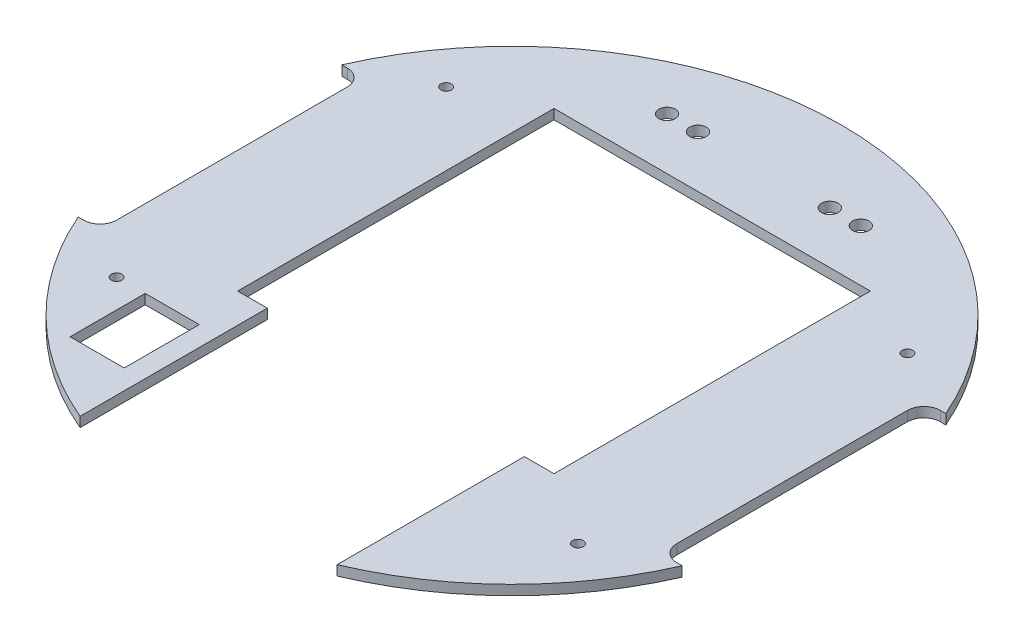
ISO-10303-21;
HEADER;
FILE_DESCRIPTION(('STEP AP214'),'2;1');
FILE_NAME('part.step','',(''),(''),'','','');
FILE_SCHEMA(('AUTOMOTIVE_DESIGN { 1 0 10303 214 1 1 1 1 }'));
ENDSEC;
DATA;
#1=APPLICATION_CONTEXT('core data for automotive mechanical design processes');
#2=APPLICATION_PROTOCOL_DEFINITION('international standard','automotive_design',2000,#1);
#3=PRODUCT_CONTEXT('',#1,'mechanical');
#4=PRODUCT('Part','Part','',(#3));
#5=PRODUCT_RELATED_PRODUCT_CATEGORY('part','',(#4));
#6=PRODUCT_DEFINITION_FORMATION('','',#4);
#7=PRODUCT_DEFINITION_CONTEXT('part definition',#1,'design');
#8=PRODUCT_DEFINITION('design','',#6,#7);
#9=PRODUCT_DEFINITION_SHAPE('','',#8);
#10=(LENGTH_UNIT() NAMED_UNIT(*) SI_UNIT(.MILLI.,.METRE.));
#11=(NAMED_UNIT(*) PLANE_ANGLE_UNIT() SI_UNIT($,.RADIAN.));
#12=(NAMED_UNIT(*) SI_UNIT($,.STERADIAN.) SOLID_ANGLE_UNIT());
#13=UNCERTAINTY_MEASURE_WITH_UNIT(LENGTH_MEASURE(1.E-05),#10,'distance_accuracy_value','');
#14=(GEOMETRIC_REPRESENTATION_CONTEXT(3) GLOBAL_UNCERTAINTY_ASSIGNED_CONTEXT((#13)) GLOBAL_UNIT_ASSIGNED_CONTEXT((#10,
#11,#12)) REPRESENTATION_CONTEXT('',''));
#15=CARTESIAN_POINT('',(0.,0.,0.));
#16=DIRECTION('',(0.,0.,1.));
#17=DIRECTION('',(1.,0.,0.));
#18=AXIS2_PLACEMENT_3D('',#15,#16,#17);
#19=CARTESIAN_POINT('',(85.,3.,0.));
#20=DIRECTION('',(1.,0.,0.));
#21=DIRECTION('',(0.,0.,-1.));
#22=AXIS2_PLACEMENT_3D('',#19,#20,#21);
#23=PLANE('',#22);
#24=DIRECTION('',(0.,0.,1.));
#25=VECTOR('',#24,1.);
#26=CARTESIAN_POINT('',(85.,0.,0.));
#27=LINE('',#26,#25);
#28=CARTESIAN_POINT('',(85.,0.,-35.));
#29=VERTEX_POINT('',#28);
#30=CARTESIAN_POINT('',(85.,0.,35.));
#31=VERTEX_POINT('',#30);
#32=EDGE_CURVE('E379',#29,#31,#27,.T.);
#33=ORIENTED_EDGE('',*,*,#32,.F.);
#34=DIRECTION('',(0.,-1.,0.));
#35=VECTOR('',#34,1.);
#36=CARTESIAN_POINT('',(85.,3.,-35.));
#37=LINE('',#36,#35);
#38=CARTESIAN_POINT('',(85.,3.,-35.));
#39=VERTEX_POINT('',#38);
#40=EDGE_CURVE('E11',#39,#29,#37,.T.);
#41=ORIENTED_EDGE('',*,*,#40,.F.);
#42=DIRECTION('',(0.,0.,1.));
#43=VECTOR('',#42,1.);
#44=CARTESIAN_POINT('',(85.,3.,0.));
#45=LINE('',#44,#43);
#46=CARTESIAN_POINT('',(85.,3.,35.));
#47=VERTEX_POINT('',#46);
#48=EDGE_CURVE('E482',#39,#47,#45,.T.);
#49=ORIENTED_EDGE('',*,*,#48,.T.);
#50=DIRECTION('',(0.,-1.,0.));
#51=VECTOR('',#50,1.);
#52=CARTESIAN_POINT('',(85.,3.,35.));
#53=LINE('',#52,#51);
#54=EDGE_CURVE('E61',#47,#31,#53,.T.);
#55=ORIENTED_EDGE('',*,*,#54,.T.);
#56=EDGE_LOOP('',(#33,#41,#49,#55));
#57=FACE_BOUND('',#56,.T.);
#58=ADVANCED_FACE('F41',(#57),#23,.T.);
#59=CARTESIAN_POINT('',(90.0000000000001,3.,-35.));
#60=DIRECTION('',(0.,-1.,0.));
#61=DIRECTION('',(0.,0.,-1.));
#62=AXIS2_PLACEMENT_3D('',#59,#60,#61);
#63=CYLINDRICAL_SURFACE('',#62,5.);
#64=CARTESIAN_POINT('',(90.0000000000001,0.,-35.));
#65=DIRECTION('',(0.,1.,0.));
#66=DIRECTION('',(0.,0.,1.));
#67=AXIS2_PLACEMENT_3D('',#64,#65,#66);
#68=CIRCLE('',#67,5.);
#69=CARTESIAN_POINT('',(90.0000000000001,0.,-40.));
#70=VERTEX_POINT('',#69);
#71=EDGE_CURVE('E375',#29,#70,#68,.F.);
#72=ORIENTED_EDGE('',*,*,#71,.T.);
#73=DIRECTION('',(0.,-1.,0.));
#74=VECTOR('',#73,1.);
#75=CARTESIAN_POINT('',(90.0000000000001,3.,-40.));
#76=LINE('',#75,#74);
#77=CARTESIAN_POINT('',(90.0000000000001,3.,-40.));
#78=VERTEX_POINT('',#77);
#79=EDGE_CURVE('E52',#78,#70,#76,.T.);
#80=ORIENTED_EDGE('',*,*,#79,.F.);
#81=CARTESIAN_POINT('',(90.0000000000001,3.,-35.));
#82=DIRECTION('',(0.,1.,0.));
#83=DIRECTION('',(0.,0.,1.));
#84=AXIS2_PLACEMENT_3D('',#81,#82,#83);
#85=CIRCLE('',#84,5.);
#86=EDGE_CURVE('E479',#39,#78,#85,.F.);
#87=ORIENTED_EDGE('',*,*,#86,.F.);
#88=ORIENTED_EDGE('',*,*,#40,.T.);
#89=EDGE_LOOP('',(#72,#80,#87,#88));
#90=FACE_BOUND('',#89,.T.);
#91=ADVANCED_FACE('F567',(#90),#63,.F.);
#92=CARTESIAN_POINT('',(0.,3.,-40.));
#93=DIRECTION('',(0.,0.,1.));
#94=DIRECTION('',(1.,0.,0.));
#95=AXIS2_PLACEMENT_3D('',#92,#93,#94);
#96=PLANE('',#95);
#97=DIRECTION('',(-1.,0.,0.));
#98=VECTOR('',#97,1.);
#99=CARTESIAN_POINT('',(0.,0.,-40.));
#100=LINE('',#99,#98);
#101=CARTESIAN_POINT('',(91.6515138991168,0.,-40.));
#102=VERTEX_POINT('',#101);
#103=EDGE_CURVE('E371',#102,#70,#100,.T.);
#104=ORIENTED_EDGE('',*,*,#103,.F.);
#105=DIRECTION('',(0.,-1.,0.));
#106=VECTOR('',#105,1.);
#107=CARTESIAN_POINT('',(91.6515138991168,3.,-40.));
#108=LINE('',#107,#106);
#109=CARTESIAN_POINT('',(91.6515138991168,3.,-40.));
#110=VERTEX_POINT('',#109);
#111=EDGE_CURVE('E289',#110,#102,#108,.T.);
#112=ORIENTED_EDGE('',*,*,#111,.F.);
#113=DIRECTION('',(-1.,0.,0.));
#114=VECTOR('',#113,1.);
#115=CARTESIAN_POINT('',(0.,3.,-40.));
#116=LINE('',#115,#114);
#117=EDGE_CURVE('E475',#110,#78,#116,.T.);
#118=ORIENTED_EDGE('',*,*,#117,.T.);
#119=ORIENTED_EDGE('',*,*,#79,.T.);
#120=EDGE_LOOP('',(#104,#112,#118,#119));
#121=FACE_BOUND('',#120,.T.);
#122=ADVANCED_FACE('F572',(#121),#96,.T.);
#123=CARTESIAN_POINT('',(0.,3.,0.));
#124=DIRECTION('',(0.,-1.,0.));
#125=DIRECTION('',(0.,0.,-1.));
#126=AXIS2_PLACEMENT_3D('',#123,#124,#125);
#127=CYLINDRICAL_SURFACE('',#126,100.);
#128=CARTESIAN_POINT('',(0.,0.,0.));
#129=DIRECTION('',(0.,1.,0.));
#130=DIRECTION('',(0.,0.,1.));
#131=AXIS2_PLACEMENT_3D('',#128,#129,#130);
#132=CIRCLE('',#131,100.);
#133=CARTESIAN_POINT('',(-91.6515138991168,0.,-40.));
#134=VERTEX_POINT('',#133);
#135=EDGE_CURVE('E367',#102,#134,#132,.T.);
#136=ORIENTED_EDGE('',*,*,#135,.T.);
#137=DIRECTION('',(0.,-1.,0.));
#138=VECTOR('',#137,1.);
#139=CARTESIAN_POINT('',(-91.6515138991168,3.,-40.));
#140=LINE('',#139,#138);
#141=CARTESIAN_POINT('',(-91.6515138991168,3.,-40.));
#142=VERTEX_POINT('',#141);
#143=EDGE_CURVE('E285',#142,#134,#140,.T.);
#144=ORIENTED_EDGE('',*,*,#143,.F.);
#145=CARTESIAN_POINT('',(0.,3.,0.));
#146=DIRECTION('',(0.,1.,0.));
#147=DIRECTION('',(0.,0.,1.));
#148=AXIS2_PLACEMENT_3D('',#145,#146,#147);
#149=CIRCLE('',#148,100.);
#150=EDGE_CURVE('E235',#110,#142,#149,.T.);
#151=ORIENTED_EDGE('',*,*,#150,.F.);
#152=ORIENTED_EDGE('',*,*,#111,.T.);
#153=EDGE_LOOP('',(#136,#144,#151,#152));
#154=FACE_BOUND('',#153,.T.);
#155=ADVANCED_FACE('F733',(#154),#127,.T.);
#156=CARTESIAN_POINT('',(0.,3.,-40.));
#157=DIRECTION('',(0.,0.,-1.));
#158=DIRECTION('',(-1.,0.,0.));
#159=AXIS2_PLACEMENT_3D('',#156,#157,#158);
#160=PLANE('',#159);
#161=DIRECTION('',(1.,0.,0.));
#162=VECTOR('',#161,1.);
#163=CARTESIAN_POINT('',(0.,0.,-40.));
#164=LINE('',#163,#162);
#165=CARTESIAN_POINT('',(-90.,0.,-40.));
#166=VERTEX_POINT('',#165);
#167=EDGE_CURVE('E363',#134,#166,#164,.T.);
#168=ORIENTED_EDGE('',*,*,#167,.T.);
#169=DIRECTION('',(0.,-1.,0.));
#170=VECTOR('',#169,1.);
#171=CARTESIAN_POINT('',(-90.,3.,-40.));
#172=LINE('',#171,#170);
#173=CARTESIAN_POINT('',(-90.,3.,-40.));
#174=VERTEX_POINT('',#173);
#175=EDGE_CURVE('E282',#174,#166,#172,.T.);
#176=ORIENTED_EDGE('',*,*,#175,.F.);
#177=DIRECTION('',(1.,0.,0.));
#178=VECTOR('',#177,1.);
#179=CARTESIAN_POINT('',(0.,3.,-40.));
#180=LINE('',#179,#178);
#181=EDGE_CURVE('E470',#142,#174,#180,.T.);
#182=ORIENTED_EDGE('',*,*,#181,.F.);
#183=ORIENTED_EDGE('',*,*,#143,.T.);
#184=EDGE_LOOP('',(#168,#176,#182,#183));
#185=FACE_BOUND('',#184,.T.);
#186=ADVANCED_FACE('F838',(#185),#160,.F.);
#187=CARTESIAN_POINT('',(-90.,3.,-35.));
#188=DIRECTION('',(0.,-1.,0.));
#189=DIRECTION('',(0.,0.,-1.));
#190=AXIS2_PLACEMENT_3D('',#187,#188,#189);
#191=CYLINDRICAL_SURFACE('',#190,5.);
#192=CARTESIAN_POINT('',(-90.,0.,-35.));
#193=DIRECTION('',(0.,1.,0.));
#194=DIRECTION('',(0.,0.,1.));
#195=AXIS2_PLACEMENT_3D('',#192,#193,#194);
#196=CIRCLE('',#195,5.);
#197=CARTESIAN_POINT('',(-85.,0.,-35.));
#198=VERTEX_POINT('',#197);
#199=EDGE_CURVE('E359',#198,#166,#196,.T.);
#200=ORIENTED_EDGE('',*,*,#199,.F.);
#201=DIRECTION('',(0.,-1.,0.));
#202=VECTOR('',#201,1.);
#203=CARTESIAN_POINT('',(-85.,3.,-35.));
#204=LINE('',#203,#202);
#205=CARTESIAN_POINT('',(-85.,3.,-35.));
#206=VERTEX_POINT('',#205);
#207=EDGE_CURVE('E279',#206,#198,#204,.T.);
#208=ORIENTED_EDGE('',*,*,#207,.F.);
#209=CARTESIAN_POINT('',(-90.,3.,-35.));
#210=DIRECTION('',(0.,1.,0.));
#211=DIRECTION('',(0.,0.,1.));
#212=AXIS2_PLACEMENT_3D('',#209,#210,#211);
#213=CIRCLE('',#212,5.);
#214=EDGE_CURVE('E466',#206,#174,#213,.T.);
#215=ORIENTED_EDGE('',*,*,#214,.T.);
#216=ORIENTED_EDGE('',*,*,#175,.T.);
#217=EDGE_LOOP('',(#200,#208,#215,#216));
#218=FACE_BOUND('',#217,.T.);
#219=ADVANCED_FACE('F829',(#218),#191,.F.);
#220=CARTESIAN_POINT('',(-85.,3.,0.));
#221=DIRECTION('',(1.,0.,0.));
#222=DIRECTION('',(0.,0.,-1.));
#223=AXIS2_PLACEMENT_3D('',#220,#221,#222);
#224=PLANE('',#223);
#225=DIRECTION('',(0.,0.,1.));
#226=VECTOR('',#225,1.);
#227=CARTESIAN_POINT('',(-85.,0.,0.));
#228=LINE('',#227,#226);
#229=CARTESIAN_POINT('',(-85.,0.,35.));
#230=VERTEX_POINT('',#229);
#231=EDGE_CURVE('E355',#198,#230,#228,.T.);
#232=ORIENTED_EDGE('',*,*,#231,.T.);
#233=DIRECTION('',(0.,-1.,0.));
#234=VECTOR('',#233,1.);
#235=CARTESIAN_POINT('',(-85.,3.,35.));
#236=LINE('',#235,#234);
#237=CARTESIAN_POINT('',(-85.,3.,35.));
#238=VERTEX_POINT('',#237);
#239=EDGE_CURVE('E275',#238,#230,#236,.T.);
#240=ORIENTED_EDGE('',*,*,#239,.F.);
#241=DIRECTION('',(0.,0.,1.));
#242=VECTOR('',#241,1.);
#243=CARTESIAN_POINT('',(-85.,3.,0.));
#244=LINE('',#243,#242);
#245=EDGE_CURVE('E462',#206,#238,#244,.T.);
#246=ORIENTED_EDGE('',*,*,#245,.F.);
#247=ORIENTED_EDGE('',*,*,#207,.T.);
#248=EDGE_LOOP('',(#232,#240,#246,#247));
#249=FACE_BOUND('',#248,.T.);
#250=ADVANCED_FACE('F820',(#249),#224,.F.);
#251=CARTESIAN_POINT('',(-90.,3.,35.));
#252=DIRECTION('',(0.,-1.,0.));
#253=DIRECTION('',(0.,0.,-1.));
#254=AXIS2_PLACEMENT_3D('',#251,#252,#253);
#255=CYLINDRICAL_SURFACE('',#254,5.);
#256=CARTESIAN_POINT('',(-90.,0.,35.));
#257=DIRECTION('',(0.,1.,0.));
#258=DIRECTION('',(0.,0.,1.));
#259=AXIS2_PLACEMENT_3D('',#256,#257,#258);
#260=CIRCLE('',#259,5.);
#261=CARTESIAN_POINT('',(-90.,0.,40.));
#262=VERTEX_POINT('',#261);
#263=EDGE_CURVE('E351',#230,#262,#260,.F.);
#264=ORIENTED_EDGE('',*,*,#263,.T.);
#265=DIRECTION('',(0.,-1.,0.));
#266=VECTOR('',#265,1.);
#267=CARTESIAN_POINT('',(-90.,3.,40.));
#268=LINE('',#267,#266);
#269=CARTESIAN_POINT('',(-90.,3.,40.));
#270=VERTEX_POINT('',#269);
#271=EDGE_CURVE('E272',#270,#262,#268,.T.);
#272=ORIENTED_EDGE('',*,*,#271,.F.);
#273=CARTESIAN_POINT('',(-90.,3.,35.));
#274=DIRECTION('',(0.,1.,0.));
#275=DIRECTION('',(0.,0.,1.));
#276=AXIS2_PLACEMENT_3D('',#273,#274,#275);
#277=CIRCLE('',#276,5.);
#278=EDGE_CURVE('E459',#238,#270,#277,.F.);
#279=ORIENTED_EDGE('',*,*,#278,.F.);
#280=ORIENTED_EDGE('',*,*,#239,.T.);
#281=EDGE_LOOP('',(#264,#272,#279,#280));
#282=FACE_BOUND('',#281,.T.);
#283=ADVANCED_FACE('F811',(#282),#255,.F.);
#284=CARTESIAN_POINT('',(0.,3.,40.));
#285=DIRECTION('',(0.,0.,-1.));
#286=DIRECTION('',(-1.,0.,0.));
#287=AXIS2_PLACEMENT_3D('',#284,#285,#286);
#288=PLANE('',#287);
#289=DIRECTION('',(1.,0.,0.));
#290=VECTOR('',#289,1.);
#291=CARTESIAN_POINT('',(0.,0.,40.));
#292=LINE('',#291,#290);
#293=CARTESIAN_POINT('',(-91.6515138991168,0.,40.));
#294=VERTEX_POINT('',#293);
#295=EDGE_CURVE('E347',#294,#262,#292,.T.);
#296=ORIENTED_EDGE('',*,*,#295,.F.);
#297=DIRECTION('',(0.,-1.,0.));
#298=VECTOR('',#297,1.);
#299=CARTESIAN_POINT('',(-91.6515138991168,3.,40.));
#300=LINE('',#299,#298);
#301=CARTESIAN_POINT('',(-91.6515138991168,3.,40.));
#302=VERTEX_POINT('',#301);
#303=EDGE_CURVE('E269',#302,#294,#300,.T.);
#304=ORIENTED_EDGE('',*,*,#303,.F.);
#305=DIRECTION('',(1.,0.,0.));
#306=VECTOR('',#305,1.);
#307=CARTESIAN_POINT('',(0.,3.,40.));
#308=LINE('',#307,#306);
#309=EDGE_CURVE('E455',#302,#270,#308,.T.);
#310=ORIENTED_EDGE('',*,*,#309,.T.);
#311=ORIENTED_EDGE('',*,*,#271,.T.);
#312=EDGE_LOOP('',(#296,#304,#310,#311));
#313=FACE_BOUND('',#312,.T.);
#314=ADVANCED_FACE('F803',(#313),#288,.T.);
#315=CARTESIAN_POINT('',(-39.,0.,92.0814856526544));
#316=VERTEX_POINT('',#315);
#317=EDGE_CURVE('E346',#294,#316,#132,.T.);
#318=ORIENTED_EDGE('',*,*,#317,.T.);
#319=DIRECTION('',(0.,-1.,0.));
#320=VECTOR('',#319,1.);
#321=CARTESIAN_POINT('',(-39.,3.,92.0814856526544));
#322=LINE('',#321,#320);
#323=CARTESIAN_POINT('',(-39.,3.,92.0814856526544));
#324=VERTEX_POINT('',#323);
#325=EDGE_CURVE('E266',#324,#316,#322,.T.);
#326=ORIENTED_EDGE('',*,*,#325,.F.);
#327=EDGE_CURVE('E234',#302,#324,#149,.T.);
#328=ORIENTED_EDGE('',*,*,#327,.F.);
#329=ORIENTED_EDGE('',*,*,#303,.T.);
#330=EDGE_LOOP('',(#318,#326,#328,#329));
#331=FACE_BOUND('',#330,.T.);
#332=ADVANCED_FACE('F734',(#331),#127,.T.);
#333=CARTESIAN_POINT('',(-39.,3.,0.));
#334=DIRECTION('',(1.,0.,0.));
#335=DIRECTION('',(0.,0.,-1.));
#336=AXIS2_PLACEMENT_3D('',#333,#334,#335);
#337=PLANE('',#336);
#338=DIRECTION('',(0.,0.,1.));
#339=VECTOR('',#338,1.);
#340=CARTESIAN_POINT('',(-39.,0.,0.));
#341=LINE('',#340,#339);
#342=CARTESIAN_POINT('',(-39.,0.,35.26));
#343=VERTEX_POINT('',#342);
#344=EDGE_CURVE('E342',#343,#316,#341,.T.);
#345=ORIENTED_EDGE('',*,*,#344,.F.);
#346=DIRECTION('',(0.,-1.,0.));
#347=VECTOR('',#346,1.);
#348=CARTESIAN_POINT('',(-39.,3.,35.26));
#349=LINE('',#348,#347);
#350=CARTESIAN_POINT('',(-39.,3.,35.26));
#351=VERTEX_POINT('',#350);
#352=EDGE_CURVE('E263',#351,#343,#349,.T.);
#353=ORIENTED_EDGE('',*,*,#352,.F.);
#354=DIRECTION('',(0.,0.,1.));
#355=VECTOR('',#354,1.);
#356=CARTESIAN_POINT('',(-39.,3.,0.));
#357=LINE('',#356,#355);
#358=EDGE_CURVE('E451',#351,#324,#357,.T.);
#359=ORIENTED_EDGE('',*,*,#358,.T.);
#360=ORIENTED_EDGE('',*,*,#325,.T.);
#361=EDGE_LOOP('',(#345,#353,#359,#360));
#362=FACE_BOUND('',#361,.T.);
#363=ADVANCED_FACE('F786',(#362),#337,.T.);
#364=CARTESIAN_POINT('',(0.,3.,35.26));
#365=DIRECTION('',(0.,0.,-1.));
#366=DIRECTION('',(-1.,0.,0.));
#367=AXIS2_PLACEMENT_3D('',#364,#365,#366);
#368=PLANE('',#367);
#369=DIRECTION('',(1.,0.,0.));
#370=VECTOR('',#369,1.);
#371=CARTESIAN_POINT('',(0.,0.,35.26));
#372=LINE('',#371,#370);
#373=CARTESIAN_POINT('',(-48.,0.,35.26));
#374=VERTEX_POINT('',#373);
#375=EDGE_CURVE('E338',#374,#343,#372,.T.);
#376=ORIENTED_EDGE('',*,*,#375,.F.);
#377=DIRECTION('',(0.,-1.,0.));
#378=VECTOR('',#377,1.);
#379=CARTESIAN_POINT('',(-48.,3.,35.26));
#380=LINE('',#379,#378);
#381=CARTESIAN_POINT('',(-48.,3.,35.26));
#382=VERTEX_POINT('',#381);
#383=EDGE_CURVE('E260',#382,#374,#380,.T.);
#384=ORIENTED_EDGE('',*,*,#383,.F.);
#385=DIRECTION('',(1.,0.,0.));
#386=VECTOR('',#385,1.);
#387=CARTESIAN_POINT('',(0.,3.,35.26));
#388=LINE('',#387,#386);
#389=EDGE_CURVE('E447',#382,#351,#388,.T.);
#390=ORIENTED_EDGE('',*,*,#389,.T.);
#391=ORIENTED_EDGE('',*,*,#352,.T.);
#392=EDGE_LOOP('',(#376,#384,#390,#391));
#393=FACE_BOUND('',#392,.T.);
#394=ADVANCED_FACE('F777',(#393),#368,.T.);
#395=CARTESIAN_POINT('',(-48.,3.,0.));
#396=DIRECTION('',(1.,0.,0.));
#397=DIRECTION('',(0.,0.,-1.));
#398=AXIS2_PLACEMENT_3D('',#395,#396,#397);
#399=PLANE('',#398);
#400=DIRECTION('',(0.,0.,1.));
#401=VECTOR('',#400,1.);
#402=CARTESIAN_POINT('',(-48.,0.,0.));
#403=LINE('',#402,#401);
#404=CARTESIAN_POINT('',(-48.,0.,-60.74));
#405=VERTEX_POINT('',#404);
#406=EDGE_CURVE('E334',#405,#374,#403,.T.);
#407=ORIENTED_EDGE('',*,*,#406,.F.);
#408=DIRECTION('',(0.,-1.,0.));
#409=VECTOR('',#408,1.);
#410=CARTESIAN_POINT('',(-48.,3.,-60.74));
#411=LINE('',#410,#409);
#412=CARTESIAN_POINT('',(-48.,3.,-60.74));
#413=VERTEX_POINT('',#412);
#414=EDGE_CURVE('E257',#413,#405,#411,.T.);
#415=ORIENTED_EDGE('',*,*,#414,.F.);
#416=DIRECTION('',(0.,0.,1.));
#417=VECTOR('',#416,1.);
#418=CARTESIAN_POINT('',(-48.,3.,0.));
#419=LINE('',#418,#417);
#420=EDGE_CURVE('E443',#413,#382,#419,.T.);
#421=ORIENTED_EDGE('',*,*,#420,.T.);
#422=ORIENTED_EDGE('',*,*,#383,.T.);
#423=EDGE_LOOP('',(#407,#415,#421,#422));
#424=FACE_BOUND('',#423,.T.);
#425=ADVANCED_FACE('F768',(#424),#399,.T.);
#426=CARTESIAN_POINT('',(0.,3.,-60.74));
#427=DIRECTION('',(0.,0.,-1.));
#428=DIRECTION('',(-1.,0.,0.));
#429=AXIS2_PLACEMENT_3D('',#426,#427,#428);
#430=PLANE('',#429);
#431=DIRECTION('',(1.,0.,0.));
#432=VECTOR('',#431,1.);
#433=CARTESIAN_POINT('',(0.,0.,-60.74));
#434=LINE('',#433,#432);
#435=CARTESIAN_POINT('',(48.,0.,-60.74));
#436=VERTEX_POINT('',#435);
#437=EDGE_CURVE('E330',#405,#436,#434,.T.);
#438=ORIENTED_EDGE('',*,*,#437,.T.);
#439=DIRECTION('',(0.,-1.,0.));
#440=VECTOR('',#439,1.);
#441=CARTESIAN_POINT('',(48.,3.,-60.74));
#442=LINE('',#441,#440);
#443=CARTESIAN_POINT('',(48.,3.,-60.74));
#444=VERTEX_POINT('',#443);
#445=EDGE_CURVE('E253',#444,#436,#442,.T.);
#446=ORIENTED_EDGE('',*,*,#445,.F.);
#447=DIRECTION('',(1.,0.,0.));
#448=VECTOR('',#447,1.);
#449=CARTESIAN_POINT('',(0.,3.,-60.74));
#450=LINE('',#449,#448);
#451=EDGE_CURVE('E439',#413,#444,#450,.T.);
#452=ORIENTED_EDGE('',*,*,#451,.F.);
#453=ORIENTED_EDGE('',*,*,#414,.T.);
#454=EDGE_LOOP('',(#438,#446,#452,#453));
#455=FACE_BOUND('',#454,.T.);
#456=ADVANCED_FACE('F759',(#455),#430,.F.);
#457=CARTESIAN_POINT('',(48.,3.,0.));
#458=DIRECTION('',(1.,0.,0.));
#459=DIRECTION('',(0.,0.,-1.));
#460=AXIS2_PLACEMENT_3D('',#457,#458,#459);
#461=PLANE('',#460);
#462=DIRECTION('',(0.,0.,1.));
#463=VECTOR('',#462,1.);
#464=CARTESIAN_POINT('',(48.,0.,0.));
#465=LINE('',#464,#463);
#466=CARTESIAN_POINT('',(48.0000000000001,0.,35.26));
#467=VERTEX_POINT('',#466);
#468=EDGE_CURVE('E326',#436,#467,#465,.T.);
#469=ORIENTED_EDGE('',*,*,#468,.T.);
#470=DIRECTION('',(0.,-1.,0.));
#471=VECTOR('',#470,1.);
#472=CARTESIAN_POINT('',(48.0000000000001,3.,35.26));
#473=LINE('',#472,#471);
#474=CARTESIAN_POINT('',(48.0000000000001,3.,35.26));
#475=VERTEX_POINT('',#474);
#476=EDGE_CURVE('E250',#475,#467,#473,.T.);
#477=ORIENTED_EDGE('',*,*,#476,.F.);
#478=DIRECTION('',(0.,0.,1.));
#479=VECTOR('',#478,1.);
#480=CARTESIAN_POINT('',(48.,3.,0.));
#481=LINE('',#480,#479);
#482=EDGE_CURVE('E436',#444,#475,#481,.T.);
#483=ORIENTED_EDGE('',*,*,#482,.F.);
#484=ORIENTED_EDGE('',*,*,#445,.T.);
#485=EDGE_LOOP('',(#469,#477,#483,#484));
#486=FACE_BOUND('',#485,.T.);
#487=ADVANCED_FACE('F750',(#486),#461,.F.);
#488=CARTESIAN_POINT('',(0.,3.,35.26));
#489=DIRECTION('',(0.,0.,-1.));
#490=DIRECTION('',(-1.,0.,0.));
#491=AXIS2_PLACEMENT_3D('',#488,#489,#490);
#492=PLANE('',#491);
#493=DIRECTION('',(1.,0.,0.));
#494=VECTOR('',#493,1.);
#495=CARTESIAN_POINT('',(0.,0.,35.26));
#496=LINE('',#495,#494);
#497=CARTESIAN_POINT('',(39.,0.,35.26));
#498=VERTEX_POINT('',#497);
#499=EDGE_CURVE('E322',#498,#467,#496,.T.);
#500=ORIENTED_EDGE('',*,*,#499,.F.);
#501=DIRECTION('',(0.,-1.,0.));
#502=VECTOR('',#501,1.);
#503=CARTESIAN_POINT('',(39.,3.,35.26));
#504=LINE('',#503,#502);
#505=CARTESIAN_POINT('',(39.,3.,35.26));
#506=VERTEX_POINT('',#505);
#507=EDGE_CURVE('E243',#506,#498,#504,.T.);
#508=ORIENTED_EDGE('',*,*,#507,.F.);
#509=DIRECTION('',(1.,0.,0.));
#510=VECTOR('',#509,1.);
#511=CARTESIAN_POINT('',(0.,3.,35.26));
#512=LINE('',#511,#510);
#513=EDGE_CURVE('E432',#506,#475,#512,.T.);
#514=ORIENTED_EDGE('',*,*,#513,.T.);
#515=ORIENTED_EDGE('',*,*,#476,.T.);
#516=EDGE_LOOP('',(#500,#508,#514,#515));
#517=FACE_BOUND('',#516,.T.);
#518=ADVANCED_FACE('F741',(#517),#492,.T.);
#519=CARTESIAN_POINT('',(39.,3.,0.));
#520=DIRECTION('',(1.,0.,0.));
#521=DIRECTION('',(0.,0.,-1.));
#522=AXIS2_PLACEMENT_3D('',#519,#520,#521);
#523=PLANE('',#522);
#524=DIRECTION('',(0.,0.,1.));
#525=VECTOR('',#524,1.);
#526=CARTESIAN_POINT('',(39.,0.,0.));
#527=LINE('',#526,#525);
#528=CARTESIAN_POINT('',(39.,0.,92.0814856526544));
#529=VERTEX_POINT('',#528);
#530=EDGE_CURVE('E318',#498,#529,#527,.T.);
#531=ORIENTED_EDGE('',*,*,#530,.T.);
#532=DIRECTION('',(0.,-1.,0.));
#533=VECTOR('',#532,1.);
#534=CARTESIAN_POINT('',(39.,3.,92.0814856526544));
#535=LINE('',#534,#533);
#536=CARTESIAN_POINT('',(39.,3.,92.0814856526544));
#537=VERTEX_POINT('',#536);
#538=EDGE_CURVE('E239',#537,#529,#535,.T.);
#539=ORIENTED_EDGE('',*,*,#538,.F.);
#540=DIRECTION('',(0.,0.,1.));
#541=VECTOR('',#540,1.);
#542=CARTESIAN_POINT('',(39.,3.,0.));
#543=LINE('',#542,#541);
#544=EDGE_CURVE('E228',#506,#537,#543,.T.);
#545=ORIENTED_EDGE('',*,*,#544,.F.);
#546=ORIENTED_EDGE('',*,*,#507,.T.);
#547=EDGE_LOOP('',(#531,#539,#545,#546));
#548=FACE_BOUND('',#547,.T.);
#549=ADVANCED_FACE('F731',(#548),#523,.F.);
#550=CARTESIAN_POINT('',(91.6515138991169,0.,40.));
#551=VERTEX_POINT('',#550);
#552=EDGE_CURVE('E237',#529,#551,#132,.T.);
#553=ORIENTED_EDGE('',*,*,#552,.T.);
#554=DIRECTION('',(0.,-1.,0.));
#555=VECTOR('',#554,1.);
#556=CARTESIAN_POINT('',(91.6515138991169,3.,40.));
#557=LINE('',#556,#555);
#558=CARTESIAN_POINT('',(91.6515138991169,3.,40.));
#559=VERTEX_POINT('',#558);
#560=EDGE_CURVE('E215',#559,#551,#557,.T.);
#561=ORIENTED_EDGE('',*,*,#560,.F.);
#562=EDGE_CURVE('E221',#537,#559,#149,.T.);
#563=ORIENTED_EDGE('',*,*,#562,.F.);
#564=ORIENTED_EDGE('',*,*,#538,.T.);
#565=EDGE_LOOP('',(#553,#561,#563,#564));
#566=FACE_BOUND('',#565,.T.);
#567=ADVANCED_FACE('F236',(#566),#127,.T.);
#568=CARTESIAN_POINT('',(0.,3.,40.));
#569=DIRECTION('',(0.,0.,1.));
#570=DIRECTION('',(1.,0.,0.));
#571=AXIS2_PLACEMENT_3D('',#568,#569,#570);
#572=PLANE('',#571);
#573=DIRECTION('',(-1.,0.,0.));
#574=VECTOR('',#573,1.);
#575=CARTESIAN_POINT('',(0.,0.,40.));
#576=LINE('',#575,#574);
#577=CARTESIAN_POINT('',(90.0000000000001,0.,40.));
#578=VERTEX_POINT('',#577);
#579=EDGE_CURVE('E315',#551,#578,#576,.T.);
#580=ORIENTED_EDGE('',*,*,#579,.T.);
#581=DIRECTION('',(0.,-1.,0.));
#582=VECTOR('',#581,1.);
#583=CARTESIAN_POINT('',(90.0000000000001,3.,40.));
#584=LINE('',#583,#582);
#585=CARTESIAN_POINT('',(90.0000000000001,3.,40.));
#586=VERTEX_POINT('',#585);
#587=EDGE_CURVE('E135',#586,#578,#584,.T.);
#588=ORIENTED_EDGE('',*,*,#587,.F.);
#589=DIRECTION('',(-1.,0.,0.));
#590=VECTOR('',#589,1.);
#591=CARTESIAN_POINT('',(0.,3.,40.));
#592=LINE('',#591,#590);
#593=EDGE_CURVE('E211',#559,#586,#592,.T.);
#594=ORIENTED_EDGE('',*,*,#593,.F.);
#595=ORIENTED_EDGE('',*,*,#560,.T.);
#596=EDGE_LOOP('',(#580,#588,#594,#595));
#597=FACE_BOUND('',#596,.T.);
#598=ADVANCED_FACE('F213',(#597),#572,.F.);
#599=CARTESIAN_POINT('',(0.,3.,49.9008702459599));
#600=DIRECTION('',(0.,0.,-1.));
#601=DIRECTION('',(-1.,0.,0.));
#602=AXIS2_PLACEMENT_3D('',#599,#600,#601);
#603=PLANE('',#602);
#604=DIRECTION('',(1.,0.,0.));
#605=VECTOR('',#604,1.);
#606=CARTESIAN_POINT('',(0.,0.,49.9008702459599));
#607=LINE('',#606,#605);
#608=CARTESIAN_POINT('',(-61.4048345951979,0.,49.9008702459599));
#609=VERTEX_POINT('',#608);
#610=CARTESIAN_POINT('',(-45.0048345951979,0.,49.9008702459599));
#611=VERTEX_POINT('',#610);
#612=EDGE_CURVE('E405',#609,#611,#607,.T.);
#613=ORIENTED_EDGE('',*,*,#612,.T.);
#614=DIRECTION('',(0.,-1.,0.));
#615=VECTOR('',#614,1.);
#616=CARTESIAN_POINT('',(-45.0048345951979,3.,49.9008702459599));
#617=LINE('',#616,#615);
#618=CARTESIAN_POINT('',(-45.0048345951979,3.,49.9008702459599));
#619=VERTEX_POINT('',#618);
#620=EDGE_CURVE('E45',#619,#611,#617,.T.);
#621=ORIENTED_EDGE('',*,*,#620,.F.);
#622=DIRECTION('',(1.,0.,0.));
#623=VECTOR('',#622,1.);
#624=CARTESIAN_POINT('',(0.,3.,49.9008702459599));
#625=LINE('',#624,#623);
#626=CARTESIAN_POINT('',(-61.4048345951979,3.,49.9008702459599));
#627=VERTEX_POINT('',#626);
#628=EDGE_CURVE('E506',#627,#619,#625,.T.);
#629=ORIENTED_EDGE('',*,*,#628,.F.);
#630=DIRECTION('',(0.,-1.,0.));
#631=VECTOR('',#630,1.);
#632=CARTESIAN_POINT('',(-61.4048345951979,3.,49.9008702459599));
#633=LINE('',#632,#631);
#634=EDGE_CURVE('E294',#627,#609,#633,.T.);
#635=ORIENTED_EDGE('',*,*,#634,.T.);
#636=EDGE_LOOP('',(#613,#621,#629,#635));
#637=FACE_BOUND('',#636,.T.);
#638=ADVANCED_FACE('F600',(#637),#603,.F.);
#639=CARTESIAN_POINT('',(-45.0048345951979,3.,0.));
#640=DIRECTION('',(1.,0.,0.));
#641=DIRECTION('',(0.,0.,-1.));
#642=AXIS2_PLACEMENT_3D('',#639,#640,#641);
#643=PLANE('',#642);
#644=DIRECTION('',(0.,0.,1.));
#645=VECTOR('',#644,1.);
#646=CARTESIAN_POINT('',(-45.0048345951979,0.,0.));
#647=LINE('',#646,#645);
#648=CARTESIAN_POINT('',(-45.0048345951979,0.,72.7008702459599));
#649=VERTEX_POINT('',#648);
#650=EDGE_CURVE('E402',#611,#649,#647,.T.);
#651=ORIENTED_EDGE('',*,*,#650,.T.);
#652=DIRECTION('',(0.,-1.,0.));
#653=VECTOR('',#652,1.);
#654=CARTESIAN_POINT('',(-45.0048345951979,3.,72.7008702459599));
#655=LINE('',#654,#653);
#656=CARTESIAN_POINT('',(-45.0048345951979,3.,72.7008702459599));
#657=VERTEX_POINT('',#656);
#658=EDGE_CURVE('E299',#657,#649,#655,.T.);
#659=ORIENTED_EDGE('',*,*,#658,.F.);
#660=DIRECTION('',(0.,0.,1.));
#661=VECTOR('',#660,1.);
#662=CARTESIAN_POINT('',(-45.0048345951979,3.,0.));
#663=LINE('',#662,#661);
#664=EDGE_CURVE('E148',#619,#657,#663,.T.);
#665=ORIENTED_EDGE('',*,*,#664,.F.);
#666=ORIENTED_EDGE('',*,*,#620,.T.);
#667=EDGE_LOOP('',(#651,#659,#665,#666));
#668=FACE_BOUND('',#667,.T.);
#669=ADVANCED_FACE('F597',(#668),#643,.F.);
#670=CARTESIAN_POINT('',(0.,3.,72.7008702459599));
#671=DIRECTION('',(0.,0.,-1.));
#672=DIRECTION('',(-1.,0.,0.));
#673=AXIS2_PLACEMENT_3D('',#670,#671,#672);
#674=PLANE('',#673);
#675=DIRECTION('',(1.,0.,0.));
#676=VECTOR('',#675,1.);
#677=CARTESIAN_POINT('',(0.,0.,72.7008702459599));
#678=LINE('',#677,#676);
#679=CARTESIAN_POINT('',(-61.4048345951979,0.,72.7008702459599));
#680=VERTEX_POINT('',#679);
#681=EDGE_CURVE('E398',#680,#649,#678,.T.);
#682=ORIENTED_EDGE('',*,*,#681,.F.);
#683=DIRECTION('',(0.,-1.,0.));
#684=VECTOR('',#683,1.);
#685=CARTESIAN_POINT('',(-61.4048345951979,3.,72.7008702459599));
#686=LINE('',#685,#684);
#687=CARTESIAN_POINT('',(-61.4048345951979,3.,72.7008702459599));
#688=VERTEX_POINT('',#687);
#689=EDGE_CURVE('E297',#688,#680,#686,.T.);
#690=ORIENTED_EDGE('',*,*,#689,.F.);
#691=DIRECTION('',(1.,0.,0.));
#692=VECTOR('',#691,1.);
#693=CARTESIAN_POINT('',(0.,3.,72.7008702459599));
#694=LINE('',#693,#692);
#695=EDGE_CURVE('E501',#688,#657,#694,.T.);
#696=ORIENTED_EDGE('',*,*,#695,.T.);
#697=ORIENTED_EDGE('',*,*,#658,.T.);
#698=EDGE_LOOP('',(#682,#690,#696,#697));
#699=FACE_BOUND('',#698,.T.);
#700=ADVANCED_FACE('F581',(#699),#674,.T.);
#701=CARTESIAN_POINT('',(29.4,3.,-76.4432733827584));
#702=DIRECTION('',(0.,-1.,0.));
#703=DIRECTION('',(0.,0.,-1.));
#704=AXIS2_PLACEMENT_3D('',#701,#702,#703);
#705=CYLINDRICAL_SURFACE('',#704,2.5);
#706=CARTESIAN_POINT('',(29.4,3.,-76.4432733827584));
#707=DIRECTION('',(0.,1.,0.));
#708=DIRECTION('',(0.,0.,1.));
#709=AXIS2_PLACEMENT_3D('',#706,#707,#708);
#710=CIRCLE('',#709,2.5);
#711=CARTESIAN_POINT('',(29.4,3.,-73.9432733827584));
#712=VERTEX_POINT('',#711);
#713=EDGE_CURVE('E485',#712,#712,#710,.F.);
#714=ORIENTED_EDGE('',*,*,#713,.F.);
#715=EDGE_LOOP('',(#714));
#716=FACE_BOUND('',#715,.T.);
#717=CARTESIAN_POINT('',(29.4,0.,-76.4432733827584));
#718=DIRECTION('',(0.,1.,0.));
#719=DIRECTION('',(0.,0.,1.));
#720=AXIS2_PLACEMENT_3D('',#717,#718,#719);
#721=CIRCLE('',#720,2.5);
#722=CARTESIAN_POINT('',(29.4,0.,-73.9432733827584));
#723=VERTEX_POINT('',#722);
#724=EDGE_CURVE('E382',#723,#723,#721,.F.);
#725=ORIENTED_EDGE('',*,*,#724,.T.);
#726=EDGE_LOOP('',(#725));
#727=FACE_BOUND('',#726,.T.);
#728=ADVANCED_FACE('F577',(#716,#727),#705,.F.);
#729=CARTESIAN_POINT('',(-70.,3.,-50.));
#730=DIRECTION('',(0.,-1.,0.));
#731=DIRECTION('',(0.,0.,-1.));
#732=AXIS2_PLACEMENT_3D('',#729,#730,#731);
#733=CYLINDRICAL_SURFACE('',#732,1.60000000000001);
#734=CARTESIAN_POINT('',(-70.,3.,-50.));
#735=DIRECTION('',(0.,1.,0.));
#736=DIRECTION('',(0.,0.,1.));
#737=AXIS2_PLACEMENT_3D('',#734,#735,#736);
#738=CIRCLE('',#737,1.60000000000001);
#739=CARTESIAN_POINT('',(-70.,3.,-48.4));
#740=VERTEX_POINT('',#739);
#741=EDGE_CURVE('E489',#740,#740,#738,.F.);
#742=ORIENTED_EDGE('',*,*,#741,.F.);
#743=EDGE_LOOP('',(#742));
#744=FACE_BOUND('',#743,.T.);
#745=CARTESIAN_POINT('',(-70.,0.,-50.));
#746=DIRECTION('',(0.,1.,0.));
#747=DIRECTION('',(0.,0.,1.));
#748=AXIS2_PLACEMENT_3D('',#745,#746,#747);
#749=CIRCLE('',#748,1.60000000000001);
#750=CARTESIAN_POINT('',(-70.,0.,-48.4));
#751=VERTEX_POINT('',#750);
#752=EDGE_CURVE('E386',#751,#751,#749,.F.);
#753=ORIENTED_EDGE('',*,*,#752,.T.);
#754=EDGE_LOOP('',(#753));
#755=FACE_BOUND('',#754,.T.);
#756=ADVANCED_FACE('F580',(#744,#755),#733,.F.);
#757=CARTESIAN_POINT('',(70.,3.,-50.));
#758=DIRECTION('',(0.,-1.,0.));
#759=DIRECTION('',(0.,0.,-1.));
#760=AXIS2_PLACEMENT_3D('',#757,#758,#759);
#761=CYLINDRICAL_SURFACE('',#760,1.60000000000001);
#762=CARTESIAN_POINT('',(70.,3.,-50.));
#763=DIRECTION('',(0.,1.,0.));
#764=DIRECTION('',(0.,0.,1.));
#765=AXIS2_PLACEMENT_3D('',#762,#763,#764);
#766=CIRCLE('',#765,1.60000000000001);
#767=CARTESIAN_POINT('',(70.,3.,-48.4));
#768=VERTEX_POINT('',#767);
#769=EDGE_CURVE('E493',#768,#768,#766,.T.);
#770=ORIENTED_EDGE('',*,*,#769,.T.);
#771=EDGE_LOOP('',(#770));
#772=FACE_BOUND('',#771,.T.);
#773=CARTESIAN_POINT('',(70.,0.,-50.));
#774=DIRECTION('',(0.,1.,0.));
#775=DIRECTION('',(0.,0.,1.));
#776=AXIS2_PLACEMENT_3D('',#773,#774,#775);
#777=CIRCLE('',#776,1.60000000000001);
#778=CARTESIAN_POINT('',(70.,0.,-48.4));
#779=VERTEX_POINT('',#778);
#780=EDGE_CURVE('E390',#779,#779,#777,.T.);
#781=ORIENTED_EDGE('',*,*,#780,.F.);
#782=EDGE_LOOP('',(#781));
#783=FACE_BOUND('',#782,.T.);
#784=ADVANCED_FACE('F585',(#772,#783),#761,.F.);
#785=CARTESIAN_POINT('',(-61.4048345951979,3.,0.));
#786=DIRECTION('',(1.,0.,0.));
#787=DIRECTION('',(0.,0.,-1.));
#788=AXIS2_PLACEMENT_3D('',#785,#786,#787);
#789=PLANE('',#788);
#790=DIRECTION('',(0.,0.,1.));
#791=VECTOR('',#790,1.);
#792=CARTESIAN_POINT('',(-61.4048345951979,0.,0.));
#793=LINE('',#792,#791);
#794=EDGE_CURVE('E394',#609,#680,#793,.T.);
#795=ORIENTED_EDGE('',*,*,#794,.F.);
#796=ORIENTED_EDGE('',*,*,#634,.F.);
#797=DIRECTION('',(0.,0.,1.));
#798=VECTOR('',#797,1.);
#799=CARTESIAN_POINT('',(-61.4048345951979,3.,0.));
#800=LINE('',#799,#798);
#801=EDGE_CURVE('E497',#627,#688,#800,.T.);
#802=ORIENTED_EDGE('',*,*,#801,.T.);
#803=ORIENTED_EDGE('',*,*,#689,.T.);
#804=EDGE_LOOP('',(#795,#796,#802,#803));
#805=FACE_BOUND('',#804,.T.);
#806=ADVANCED_FACE('F589',(#805),#789,.T.);
#807=CARTESIAN_POINT('',(-70.,3.,50.));
#808=DIRECTION('',(0.,-1.,0.));
#809=DIRECTION('',(0.,0.,-1.));
#810=AXIS2_PLACEMENT_3D('',#807,#808,#809);
#811=CYLINDRICAL_SURFACE('',#810,1.60000000000001);
#812=CARTESIAN_POINT('',(-70.,3.,50.));
#813=DIRECTION('',(0.,1.,0.));
#814=DIRECTION('',(0.,0.,1.));
#815=AXIS2_PLACEMENT_3D('',#812,#813,#814);
#816=CIRCLE('',#815,1.60000000000001);
#817=CARTESIAN_POINT('',(-70.,3.,51.6));
#818=VERTEX_POINT('',#817);
#819=EDGE_CURVE('E509',#818,#818,#816,.T.);
#820=ORIENTED_EDGE('',*,*,#819,.T.);
#821=EDGE_LOOP('',(#820));
#822=FACE_BOUND('',#821,.T.);
#823=CARTESIAN_POINT('',(-70.,0.,50.));
#824=DIRECTION('',(0.,1.,0.));
#825=DIRECTION('',(0.,0.,1.));
#826=AXIS2_PLACEMENT_3D('',#823,#824,#825);
#827=CIRCLE('',#826,1.60000000000001);
#828=CARTESIAN_POINT('',(-70.,0.,51.6));
#829=VERTEX_POINT('',#828);
#830=EDGE_CURVE('E408',#829,#829,#827,.T.);
#831=ORIENTED_EDGE('',*,*,#830,.F.);
#832=EDGE_LOOP('',(#831));
#833=FACE_BOUND('',#832,.T.);
#834=ADVANCED_FACE('F593',(#822,#833),#811,.F.);
#835=CARTESIAN_POINT('',(70.,3.,50.));
#836=DIRECTION('',(0.,-1.,0.));
#837=DIRECTION('',(0.,0.,-1.));
#838=AXIS2_PLACEMENT_3D('',#835,#836,#837);
#839=CYLINDRICAL_SURFACE('',#838,1.60000000000001);
#840=CARTESIAN_POINT('',(70.,3.,50.));
#841=DIRECTION('',(0.,1.,0.));
#842=DIRECTION('',(0.,0.,1.));
#843=AXIS2_PLACEMENT_3D('',#840,#841,#842);
#844=CIRCLE('',#843,1.60000000000001);
#845=CARTESIAN_POINT('',(70.,3.,51.6));
#846=VERTEX_POINT('',#845);
#847=EDGE_CURVE('E513',#846,#846,#844,.F.);
#848=ORIENTED_EDGE('',*,*,#847,.F.);
#849=EDGE_LOOP('',(#848));
#850=FACE_BOUND('',#849,.T.);
#851=CARTESIAN_POINT('',(70.,0.,50.));
#852=DIRECTION('',(0.,1.,0.));
#853=DIRECTION('',(0.,0.,1.));
#854=AXIS2_PLACEMENT_3D('',#851,#852,#853);
#855=CIRCLE('',#854,1.60000000000001);
#856=CARTESIAN_POINT('',(70.,0.,51.6));
#857=VERTEX_POINT('',#856);
#858=EDGE_CURVE('E412',#857,#857,#855,.F.);
#859=ORIENTED_EDGE('',*,*,#858,.T.);
#860=EDGE_LOOP('',(#859));
#861=FACE_BOUND('',#860,.T.);
#862=ADVANCED_FACE('F606',(#850,#861),#839,.F.);
#863=CARTESIAN_POINT('',(-29.4,3.,-76.4432733827584));
#864=DIRECTION('',(0.,-1.,0.));
#865=DIRECTION('',(0.,0.,-1.));
#866=AXIS2_PLACEMENT_3D('',#863,#864,#865);
#867=CYLINDRICAL_SURFACE('',#866,2.5);
#868=CARTESIAN_POINT('',(-29.4,3.,-76.4432733827584));
#869=DIRECTION('',(0.,1.,0.));
#870=DIRECTION('',(0.,0.,1.));
#871=AXIS2_PLACEMENT_3D('',#868,#869,#870);
#872=CIRCLE('',#871,2.5);
#873=CARTESIAN_POINT('',(-29.4,3.,-73.9432733827584));
#874=VERTEX_POINT('',#873);
#875=EDGE_CURVE('E517',#874,#874,#872,.T.);
#876=ORIENTED_EDGE('',*,*,#875,.T.);
#877=EDGE_LOOP('',(#876));
#878=FACE_BOUND('',#877,.T.);
#879=CARTESIAN_POINT('',(-29.4,0.,-76.4432733827584));
#880=DIRECTION('',(0.,1.,0.));
#881=DIRECTION('',(0.,0.,1.));
#882=AXIS2_PLACEMENT_3D('',#879,#880,#881);
#883=CIRCLE('',#882,2.5);
#884=CARTESIAN_POINT('',(-29.4,0.,-73.9432733827584));
#885=VERTEX_POINT('',#884);
#886=EDGE_CURVE('E416',#885,#885,#883,.T.);
#887=ORIENTED_EDGE('',*,*,#886,.F.);
#888=EDGE_LOOP('',(#887));
#889=FACE_BOUND('',#888,.T.);
#890=ADVANCED_FACE('F610',(#878,#889),#867,.F.);
#891=CARTESIAN_POINT('',(-20.,3.,-76.4432733827584));
#892=DIRECTION('',(0.,-1.,0.));
#893=DIRECTION('',(0.,0.,-1.));
#894=AXIS2_PLACEMENT_3D('',#891,#892,#893);
#895=CYLINDRICAL_SURFACE('',#894,2.5);
#896=CARTESIAN_POINT('',(-20.,3.,-76.4432733827584));
#897=DIRECTION('',(0.,1.,0.));
#898=DIRECTION('',(0.,0.,1.));
#899=AXIS2_PLACEMENT_3D('',#896,#897,#898);
#900=CIRCLE('',#899,2.5);
#901=CARTESIAN_POINT('',(-20.,3.,-73.9432733827584));
#902=VERTEX_POINT('',#901);
#903=EDGE_CURVE('E521',#902,#902,#900,.T.);
#904=ORIENTED_EDGE('',*,*,#903,.T.);
#905=EDGE_LOOP('',(#904));
#906=FACE_BOUND('',#905,.T.);
#907=CARTESIAN_POINT('',(-20.,0.,-76.4432733827584));
#908=DIRECTION('',(0.,1.,0.));
#909=DIRECTION('',(0.,0.,1.));
#910=AXIS2_PLACEMENT_3D('',#907,#908,#909);
#911=CIRCLE('',#910,2.5);
#912=CARTESIAN_POINT('',(-20.,0.,-73.9432733827584));
#913=VERTEX_POINT('',#912);
#914=EDGE_CURVE('E420',#913,#913,#911,.T.);
#915=ORIENTED_EDGE('',*,*,#914,.F.);
#916=EDGE_LOOP('',(#915));
#917=FACE_BOUND('',#916,.T.);
#918=ADVANCED_FACE('F534',(#906,#917),#895,.F.);
#919=CARTESIAN_POINT('',(20.,3.,-76.4432733827584));
#920=DIRECTION('',(0.,-1.,0.));
#921=DIRECTION('',(0.,0.,-1.));
#922=AXIS2_PLACEMENT_3D('',#919,#920,#921);
#923=CYLINDRICAL_SURFACE('',#922,2.5);
#924=CARTESIAN_POINT('',(20.,3.,-76.4432733827584));
#925=DIRECTION('',(0.,1.,0.));
#926=DIRECTION('',(0.,0.,1.));
#927=AXIS2_PLACEMENT_3D('',#924,#925,#926);
#928=CIRCLE('',#927,2.5);
#929=CARTESIAN_POINT('',(20.,3.,-73.9432733827584));
#930=VERTEX_POINT('',#929);
#931=EDGE_CURVE('E314',#930,#930,#928,.F.);
#932=ORIENTED_EDGE('',*,*,#931,.F.);
#933=EDGE_LOOP('',(#932));
#934=FACE_BOUND('',#933,.T.);
#935=CARTESIAN_POINT('',(20.,0.,-76.4432733827584));
#936=DIRECTION('',(0.,1.,0.));
#937=DIRECTION('',(0.,0.,1.));
#938=AXIS2_PLACEMENT_3D('',#935,#936,#937);
#939=CIRCLE('',#938,2.5);
#940=CARTESIAN_POINT('',(20.,0.,-73.9432733827584));
#941=VERTEX_POINT('',#940);
#942=EDGE_CURVE('E424',#941,#941,#939,.F.);
#943=ORIENTED_EDGE('',*,*,#942,.T.);
#944=EDGE_LOOP('',(#943));
#945=FACE_BOUND('',#944,.T.);
#946=ADVANCED_FACE('F43',(#934,#945),#923,.F.);
#947=CARTESIAN_POINT('',(90.0000000000001,3.,35.));
#948=DIRECTION('',(0.,-1.,0.));
#949=DIRECTION('',(0.,0.,-1.));
#950=AXIS2_PLACEMENT_3D('',#947,#948,#949);
#951=CYLINDRICAL_SURFACE('',#950,5.);
#952=CARTESIAN_POINT('',(90.0000000000001,0.,35.));
#953=DIRECTION('',(0.,1.,0.));
#954=DIRECTION('',(0.,0.,1.));
#955=AXIS2_PLACEMENT_3D('',#952,#953,#954);
#956=CIRCLE('',#955,5.);
#957=EDGE_CURVE('E310',#31,#578,#956,.T.);
#958=ORIENTED_EDGE('',*,*,#957,.F.);
#959=ORIENTED_EDGE('',*,*,#54,.F.);
#960=CARTESIAN_POINT('',(90.0000000000001,3.,35.));
#961=DIRECTION('',(0.,1.,0.));
#962=DIRECTION('',(0.,0.,1.));
#963=AXIS2_PLACEMENT_3D('',#960,#961,#962);
#964=CIRCLE('',#963,5.);
#965=EDGE_CURVE('E220',#47,#586,#964,.T.);
#966=ORIENTED_EDGE('',*,*,#965,.T.);
#967=ORIENTED_EDGE('',*,*,#587,.T.);
#968=EDGE_LOOP('',(#958,#959,#966,#967));
#969=FACE_BOUND('',#968,.T.);
#970=ADVANCED_FACE('F533',(#969),#951,.F.);
#971=CARTESIAN_POINT('',(0.,3.,0.));
#972=DIRECTION('',(0.,1.,0.));
#973=DIRECTION('',(0.,0.,1.));
#974=AXIS2_PLACEMENT_3D('',#971,#972,#973);
#975=PLANE('',#974);
#976=ORIENTED_EDGE('',*,*,#931,.T.);
#977=EDGE_LOOP('',(#976));
#978=FACE_BOUND('',#977,.T.);
#979=ORIENTED_EDGE('',*,*,#903,.F.);
#980=EDGE_LOOP('',(#979));
#981=FACE_BOUND('',#980,.T.);
#982=ORIENTED_EDGE('',*,*,#875,.F.);
#983=EDGE_LOOP('',(#982));
#984=FACE_BOUND('',#983,.T.);
#985=ORIENTED_EDGE('',*,*,#847,.T.);
#986=EDGE_LOOP('',(#985));
#987=FACE_BOUND('',#986,.T.);
#988=ORIENTED_EDGE('',*,*,#819,.F.);
#989=EDGE_LOOP('',(#988));
#990=FACE_BOUND('',#989,.T.);
#991=ORIENTED_EDGE('',*,*,#628,.T.);
#992=ORIENTED_EDGE('',*,*,#664,.T.);
#993=ORIENTED_EDGE('',*,*,#695,.F.);
#994=ORIENTED_EDGE('',*,*,#801,.F.);
#995=EDGE_LOOP('',(#991,#992,#993,#994));
#996=FACE_BOUND('',#995,.T.);
#997=ORIENTED_EDGE('',*,*,#769,.F.);
#998=EDGE_LOOP('',(#997));
#999=FACE_BOUND('',#998,.T.);
#1000=ORIENTED_EDGE('',*,*,#741,.T.);
#1001=EDGE_LOOP('',(#1000));
#1002=FACE_BOUND('',#1001,.T.);
#1003=ORIENTED_EDGE('',*,*,#713,.T.);
#1004=EDGE_LOOP('',(#1003));
#1005=FACE_BOUND('',#1004,.T.);
#1006=ORIENTED_EDGE('',*,*,#48,.F.);
#1007=ORIENTED_EDGE('',*,*,#86,.T.);
#1008=ORIENTED_EDGE('',*,*,#117,.F.);
#1009=ORIENTED_EDGE('',*,*,#150,.T.);
#1010=ORIENTED_EDGE('',*,*,#181,.T.);
#1011=ORIENTED_EDGE('',*,*,#214,.F.);
#1012=ORIENTED_EDGE('',*,*,#245,.T.);
#1013=ORIENTED_EDGE('',*,*,#278,.T.);
#1014=ORIENTED_EDGE('',*,*,#309,.F.);
#1015=ORIENTED_EDGE('',*,*,#327,.T.);
#1016=ORIENTED_EDGE('',*,*,#358,.F.);
#1017=ORIENTED_EDGE('',*,*,#389,.F.);
#1018=ORIENTED_EDGE('',*,*,#420,.F.);
#1019=ORIENTED_EDGE('',*,*,#451,.T.);
#1020=ORIENTED_EDGE('',*,*,#482,.T.);
#1021=ORIENTED_EDGE('',*,*,#513,.F.);
#1022=ORIENTED_EDGE('',*,*,#544,.T.);
#1023=ORIENTED_EDGE('',*,*,#562,.T.);
#1024=ORIENTED_EDGE('',*,*,#593,.T.);
#1025=ORIENTED_EDGE('',*,*,#965,.F.);
#1026=EDGE_LOOP('',(#1006,#1007,#1008,#1009,#1010,#1011,#1012,#1013,#1014,#1015,#1016,#1017,
#1018,#1019,#1020,#1021,#1022,#1023,#1024,#1025));
#1027=FACE_BOUND('',#1026,.T.);
#1028=ADVANCED_FACE('F225',(#978,#981,#984,#987,#990,#996,#999,#1002,#1005,#1027),#975,.T.);
#1029=CARTESIAN_POINT('',(0.,0.,0.));
#1030=DIRECTION('',(0.,1.,0.));
#1031=DIRECTION('',(0.,0.,1.));
#1032=AXIS2_PLACEMENT_3D('',#1029,#1030,#1031);
#1033=PLANE('',#1032);
#1034=ORIENTED_EDGE('',*,*,#942,.F.);
#1035=EDGE_LOOP('',(#1034));
#1036=FACE_BOUND('',#1035,.T.);
#1037=ORIENTED_EDGE('',*,*,#914,.T.);
#1038=EDGE_LOOP('',(#1037));
#1039=FACE_BOUND('',#1038,.T.);
#1040=ORIENTED_EDGE('',*,*,#886,.T.);
#1041=EDGE_LOOP('',(#1040));
#1042=FACE_BOUND('',#1041,.T.);
#1043=ORIENTED_EDGE('',*,*,#858,.F.);
#1044=EDGE_LOOP('',(#1043));
#1045=FACE_BOUND('',#1044,.T.);
#1046=ORIENTED_EDGE('',*,*,#830,.T.);
#1047=EDGE_LOOP('',(#1046));
#1048=FACE_BOUND('',#1047,.T.);
#1049=ORIENTED_EDGE('',*,*,#612,.F.);
#1050=ORIENTED_EDGE('',*,*,#794,.T.);
#1051=ORIENTED_EDGE('',*,*,#681,.T.);
#1052=ORIENTED_EDGE('',*,*,#650,.F.);
#1053=EDGE_LOOP('',(#1049,#1050,#1051,#1052));
#1054=FACE_BOUND('',#1053,.T.);
#1055=ORIENTED_EDGE('',*,*,#780,.T.);
#1056=EDGE_LOOP('',(#1055));
#1057=FACE_BOUND('',#1056,.T.);
#1058=ORIENTED_EDGE('',*,*,#752,.F.);
#1059=EDGE_LOOP('',(#1058));
#1060=FACE_BOUND('',#1059,.T.);
#1061=ORIENTED_EDGE('',*,*,#724,.F.);
#1062=EDGE_LOOP('',(#1061));
#1063=FACE_BOUND('',#1062,.T.);
#1064=ORIENTED_EDGE('',*,*,#32,.T.);
#1065=ORIENTED_EDGE('',*,*,#957,.T.);
#1066=ORIENTED_EDGE('',*,*,#579,.F.);
#1067=ORIENTED_EDGE('',*,*,#552,.F.);
#1068=ORIENTED_EDGE('',*,*,#530,.F.);
#1069=ORIENTED_EDGE('',*,*,#499,.T.);
#1070=ORIENTED_EDGE('',*,*,#468,.F.);
#1071=ORIENTED_EDGE('',*,*,#437,.F.);
#1072=ORIENTED_EDGE('',*,*,#406,.T.);
#1073=ORIENTED_EDGE('',*,*,#375,.T.);
#1074=ORIENTED_EDGE('',*,*,#344,.T.);
#1075=ORIENTED_EDGE('',*,*,#317,.F.);
#1076=ORIENTED_EDGE('',*,*,#295,.T.);
#1077=ORIENTED_EDGE('',*,*,#263,.F.);
#1078=ORIENTED_EDGE('',*,*,#231,.F.);
#1079=ORIENTED_EDGE('',*,*,#199,.T.);
#1080=ORIENTED_EDGE('',*,*,#167,.F.);
#1081=ORIENTED_EDGE('',*,*,#135,.F.);
#1082=ORIENTED_EDGE('',*,*,#103,.T.);
#1083=ORIENTED_EDGE('',*,*,#71,.F.);
#1084=EDGE_LOOP('',(#1064,#1065,#1066,#1067,#1068,#1069,#1070,#1071,#1072,#1073,#1074,#1075,
#1076,#1077,#1078,#1079,#1080,#1081,#1082,#1083));
#1085=FACE_BOUND('',#1084,.T.);
#1086=ADVANCED_FACE('F537',(#1036,#1039,#1042,#1045,#1048,#1054,#1057,#1060,#1063,#1085),#1033,.F.);
#1087=CLOSED_SHELL('',(#58,#91,#122,#155,#186,#219,#250,#283,#314,#332,#363,#394,#425,#456,#487,
#518,#549,#567,#598,#638,#669,#700,#728,#756,#784,#806,#834,#862,#890,#918,#946,#970,#1028,#1086));
#1088=MANIFOLD_SOLID_BREP('B2',#1087);
#1089=ADVANCED_BREP_SHAPE_REPRESENTATION('',(#18,#1088),#14);
#1090=SHAPE_DEFINITION_REPRESENTATION(#9,#1089);
ENDSEC;
END-ISO-10303-21;
